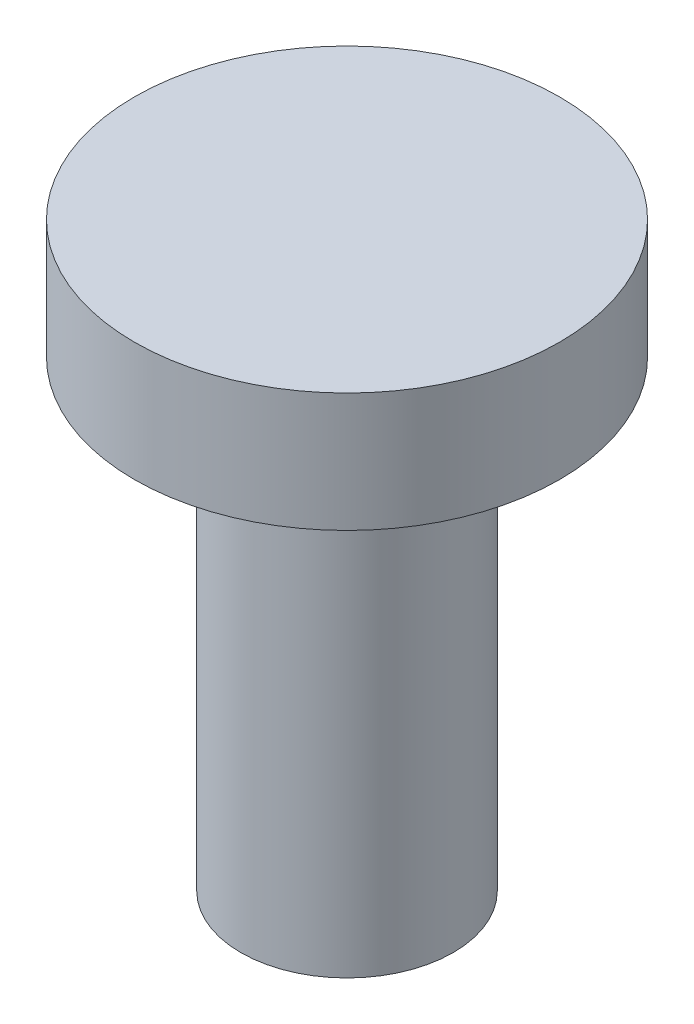
ISO-10303-21;
HEADER;
FILE_DESCRIPTION(('STEP AP214'),'2;1');
FILE_NAME('part.step','',(''),(''),'','','');
FILE_SCHEMA(('AUTOMOTIVE_DESIGN { 1 0 10303 214 1 1 1 1 }'));
ENDSEC;
DATA;
#1=APPLICATION_CONTEXT('core data for automotive mechanical design processes');
#2=APPLICATION_PROTOCOL_DEFINITION('international standard','automotive_design',2000,#1);
#3=PRODUCT_CONTEXT('',#1,'mechanical');
#4=PRODUCT('Part','Part','',(#3));
#5=PRODUCT_RELATED_PRODUCT_CATEGORY('part','',(#4));
#6=PRODUCT_DEFINITION_FORMATION('','',#4);
#7=PRODUCT_DEFINITION_CONTEXT('part definition',#1,'design');
#8=PRODUCT_DEFINITION('design','',#6,#7);
#9=PRODUCT_DEFINITION_SHAPE('','',#8);
#10=(LENGTH_UNIT() NAMED_UNIT(*) SI_UNIT(.MILLI.,.METRE.));
#11=(NAMED_UNIT(*) PLANE_ANGLE_UNIT() SI_UNIT($,.RADIAN.));
#12=(NAMED_UNIT(*) SI_UNIT($,.STERADIAN.) SOLID_ANGLE_UNIT());
#13=UNCERTAINTY_MEASURE_WITH_UNIT(LENGTH_MEASURE(1.E-05),#10,'distance_accuracy_value','');
#14=(GEOMETRIC_REPRESENTATION_CONTEXT(3) GLOBAL_UNCERTAINTY_ASSIGNED_CONTEXT((#13)) GLOBAL_UNIT_ASSIGNED_CONTEXT((#10,
#11,#12)) REPRESENTATION_CONTEXT('',''));
#15=CARTESIAN_POINT('',(0.,0.,0.));
#16=DIRECTION('',(0.,0.,1.));
#17=DIRECTION('',(1.,0.,0.));
#18=AXIS2_PLACEMENT_3D('',#15,#16,#17);
#19=CARTESIAN_POINT('',(0.,3.,0.));
#20=DIRECTION('',(0.,-1.,0.));
#21=DIRECTION('',(0.,0.,-1.));
#22=AXIS2_PLACEMENT_3D('',#19,#20,#21);
#23=CYLINDRICAL_SURFACE('',#22,5.);
#24=CARTESIAN_POINT('',(0.,0.,0.));
#25=DIRECTION('',(0.,1.,0.));
#26=DIRECTION('',(0.,0.,1.));
#27=AXIS2_PLACEMENT_3D('',#24,#25,#26);
#28=CIRCLE('',#27,5.);
#29=CARTESIAN_POINT('',(0.,0.,5.));
#30=VERTEX_POINT('',#29);
#31=EDGE_CURVE('E10',#30,#30,#28,.T.);
#32=ORIENTED_EDGE('',*,*,#31,.T.);
#33=EDGE_LOOP('',(#32));
#34=FACE_BOUND('',#33,.T.);
#35=CARTESIAN_POINT('',(0.,2.8,0.));
#36=DIRECTION('',(0.,1.,0.));
#37=DIRECTION('',(0.,0.,1.));
#38=AXIS2_PLACEMENT_3D('',#35,#36,#37);
#39=CIRCLE('',#38,5.);
#40=CARTESIAN_POINT('',(0.,2.8,5.));
#41=VERTEX_POINT('',#40);
#42=EDGE_CURVE('E45',#41,#41,#39,.T.);
#43=ORIENTED_EDGE('',*,*,#42,.F.);
#44=EDGE_LOOP('',(#43));
#45=FACE_BOUND('',#44,.T.);
#46=ADVANCED_FACE('F31',(#34,#45),#23,.T.);
#47=CARTESIAN_POINT('',(0.,0.,0.));
#48=DIRECTION('',(0.,1.,0.));
#49=DIRECTION('',(0.,0.,1.));
#50=AXIS2_PLACEMENT_3D('',#47,#48,#49);
#51=PLANE('',#50);
#52=ORIENTED_EDGE('',*,*,#31,.F.);
#53=EDGE_LOOP('',(#52));
#54=FACE_BOUND('',#53,.T.);
#55=CARTESIAN_POINT('',(0.,0.,0.));
#56=DIRECTION('',(0.,1.,0.));
#57=DIRECTION('',(0.,0.,1.));
#58=AXIS2_PLACEMENT_3D('',#55,#56,#57);
#59=CIRCLE('',#58,2.5);
#60=CARTESIAN_POINT('',(0.,0.,2.5));
#61=VERTEX_POINT('',#60);
#62=EDGE_CURVE('E37',#61,#61,#59,.T.);
#63=ORIENTED_EDGE('',*,*,#62,.T.);
#64=EDGE_LOOP('',(#63));
#65=FACE_BOUND('',#64,.T.);
#66=ADVANCED_FACE('F54',(#54,#65),#51,.F.);
#67=CARTESIAN_POINT('',(0.,3.,0.));
#68=DIRECTION('',(0.,-1.,0.));
#69=DIRECTION('',(0.,0.,-1.));
#70=AXIS2_PLACEMENT_3D('',#67,#68,#69);
#71=CYLINDRICAL_SURFACE('',#70,2.5);
#72=CARTESIAN_POINT('',(0.,-10.8857922110473,0.));
#73=DIRECTION('',(0.,-1.,0.));
#74=DIRECTION('',(0.,0.,-1.));
#75=AXIS2_PLACEMENT_3D('',#72,#73,#74);
#76=CIRCLE('',#75,2.5);
#77=CARTESIAN_POINT('',(0.,-10.8857922110473,-2.5));
#78=VERTEX_POINT('',#77);
#79=EDGE_CURVE('E41',#78,#78,#76,.T.);
#80=ORIENTED_EDGE('',*,*,#79,.F.);
#81=EDGE_LOOP('',(#80));
#82=FACE_BOUND('',#81,.T.);
#83=ORIENTED_EDGE('',*,*,#62,.F.);
#84=EDGE_LOOP('',(#83));
#85=FACE_BOUND('',#84,.T.);
#86=ADVANCED_FACE('F58',(#82,#85),#71,.T.);
#87=CARTESIAN_POINT('',(0.,-10.8857922110473,0.));
#88=DIRECTION('',(0.,-1.,0.));
#89=DIRECTION('',(0.,0.,-1.));
#90=AXIS2_PLACEMENT_3D('',#87,#88,#89);
#91=PLANE('',#90);
#92=ORIENTED_EDGE('',*,*,#79,.T.);
#93=EDGE_LOOP('',(#92));
#94=FACE_BOUND('',#93,.T.);
#95=ADVANCED_FACE('F63',(#94),#91,.T.);
#96=CARTESIAN_POINT('',(0.,2.8,0.));
#97=DIRECTION('',(0.,1.,0.));
#98=DIRECTION('',(0.,0.,1.));
#99=AXIS2_PLACEMENT_3D('',#96,#97,#98);
#100=PLANE('',#99);
#101=ORIENTED_EDGE('',*,*,#42,.T.);
#102=EDGE_LOOP('',(#101));
#103=FACE_BOUND('',#102,.T.);
#104=ADVANCED_FACE('F51',(#103),#100,.T.);
#105=CLOSED_SHELL('',(#46,#66,#86,#95,#104));
#106=MANIFOLD_SOLID_BREP('B2',#105);
#107=ADVANCED_BREP_SHAPE_REPRESENTATION('',(#18,#106),#14);
#108=SHAPE_DEFINITION_REPRESENTATION(#9,#107);
ENDSEC;
END-ISO-10303-21;
